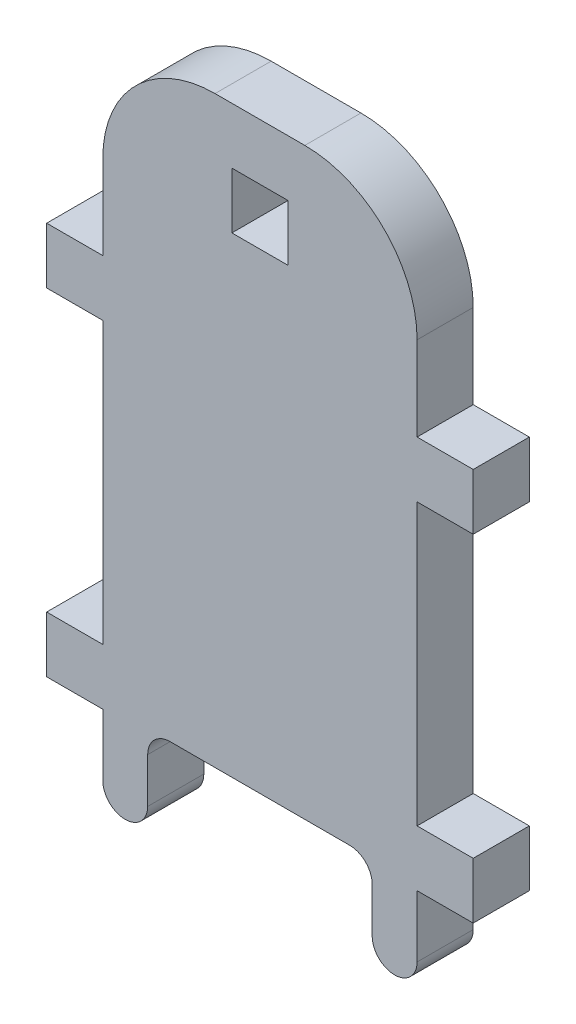
ISO-10303-21;
HEADER;
FILE_DESCRIPTION(('STEP AP214'),'2;1');
FILE_NAME('part.step','',(''),(''),'','','');
FILE_SCHEMA(('AUTOMOTIVE_DESIGN { 1 0 10303 214 1 1 1 1 }'));
ENDSEC;
DATA;
#1=APPLICATION_CONTEXT('core data for automotive mechanical design processes');
#2=APPLICATION_PROTOCOL_DEFINITION('international standard','automotive_design',2000,#1);
#3=PRODUCT_CONTEXT('',#1,'mechanical');
#4=PRODUCT('Part','Part','',(#3));
#5=PRODUCT_RELATED_PRODUCT_CATEGORY('part','',(#4));
#6=PRODUCT_DEFINITION_FORMATION('','',#4);
#7=PRODUCT_DEFINITION_CONTEXT('part definition',#1,'design');
#8=PRODUCT_DEFINITION('design','',#6,#7);
#9=PRODUCT_DEFINITION_SHAPE('','',#8);
#10=(LENGTH_UNIT() NAMED_UNIT(*) SI_UNIT(.MILLI.,.METRE.));
#11=(NAMED_UNIT(*) PLANE_ANGLE_UNIT() SI_UNIT($,.RADIAN.));
#12=(NAMED_UNIT(*) SI_UNIT($,.STERADIAN.) SOLID_ANGLE_UNIT());
#13=UNCERTAINTY_MEASURE_WITH_UNIT(LENGTH_MEASURE(1.E-05),#10,'distance_accuracy_value','');
#14=(GEOMETRIC_REPRESENTATION_CONTEXT(3) GLOBAL_UNCERTAINTY_ASSIGNED_CONTEXT((#13)) GLOBAL_UNIT_ASSIGNED_CONTEXT((#10,
#11,#12)) REPRESENTATION_CONTEXT('',''));
#15=CARTESIAN_POINT('',(0.,0.,0.));
#16=DIRECTION('',(0.,0.,1.));
#17=DIRECTION('',(1.,0.,0.));
#18=AXIS2_PLACEMENT_3D('',#15,#16,#17);
#19=CARTESIAN_POINT('',(0.,0.,5.));
#20=DIRECTION('',(0.,0.,1.));
#21=DIRECTION('',(1.,0.,0.));
#22=AXIS2_PLACEMENT_3D('',#19,#20,#21);
#23=PLANE('',#22);
#24=DIRECTION('',(0.,1.,0.));
#25=VECTOR('',#24,1.);
#26=CARTESIAN_POINT('',(28.,42.5,5.));
#27=LINE('',#26,#25);
#28=CARTESIAN_POINT('',(28.,42.5,5.));
#29=VERTEX_POINT('',#28);
#30=CARTESIAN_POINT('',(28.,50.,5.));
#31=VERTEX_POINT('',#30);
#32=EDGE_CURVE('E359',#29,#31,#27,.T.);
#33=ORIENTED_EDGE('',*,*,#32,.T.);
#34=CARTESIAN_POINT('',(18.,50.,5.));
#35=DIRECTION('',(0.,0.,1.));
#36=DIRECTION('',(1.,0.,0.));
#37=AXIS2_PLACEMENT_3D('',#34,#35,#36);
#38=CIRCLE('',#37,10.);
#39=CARTESIAN_POINT('',(18.,60.,5.));
#40=VERTEX_POINT('',#39);
#41=EDGE_CURVE('E48',#31,#40,#38,.T.);
#42=ORIENTED_EDGE('',*,*,#41,.T.);
#43=DIRECTION('',(-1.,0.,0.));
#44=VECTOR('',#43,1.);
#45=CARTESIAN_POINT('',(0.,60.,5.));
#46=LINE('',#45,#44);
#47=CARTESIAN_POINT('',(10.,60.,5.));
#48=VERTEX_POINT('',#47);
#49=EDGE_CURVE('E362',#40,#48,#46,.T.);
#50=ORIENTED_EDGE('',*,*,#49,.T.);
#51=CARTESIAN_POINT('',(10.,50.,5.));
#52=DIRECTION('',(0.,0.,1.));
#53=DIRECTION('',(1.,0.,0.));
#54=AXIS2_PLACEMENT_3D('',#51,#52,#53);
#55=CIRCLE('',#54,10.);
#56=CARTESIAN_POINT('',(0.,50.,5.));
#57=VERTEX_POINT('',#56);
#58=EDGE_CURVE('E55',#48,#57,#55,.T.);
#59=ORIENTED_EDGE('',*,*,#58,.T.);
#60=DIRECTION('',(0.,-1.,0.));
#61=VECTOR('',#60,1.);
#62=CARTESIAN_POINT('',(0.,42.5,5.));
#63=LINE('',#62,#61);
#64=CARTESIAN_POINT('',(0.,42.5,5.));
#65=VERTEX_POINT('',#64);
#66=EDGE_CURVE('E365',#57,#65,#63,.T.);
#67=ORIENTED_EDGE('',*,*,#66,.T.);
#68=DIRECTION('',(-1.,0.,0.));
#69=VECTOR('',#68,1.);
#70=CARTESIAN_POINT('',(0.,42.5,5.));
#71=LINE('',#70,#69);
#72=CARTESIAN_POINT('',(-5.,42.5,5.));
#73=VERTEX_POINT('',#72);
#74=EDGE_CURVE('E368',#65,#73,#71,.T.);
#75=ORIENTED_EDGE('',*,*,#74,.T.);
#76=DIRECTION('',(0.,-1.,0.));
#77=VECTOR('',#76,1.);
#78=CARTESIAN_POINT('',(-5.,42.5,5.));
#79=LINE('',#78,#77);
#80=CARTESIAN_POINT('',(-5.,37.5,5.));
#81=VERTEX_POINT('',#80);
#82=EDGE_CURVE('E371',#73,#81,#79,.T.);
#83=ORIENTED_EDGE('',*,*,#82,.T.);
#84=DIRECTION('',(1.,0.,0.));
#85=VECTOR('',#84,1.);
#86=CARTESIAN_POINT('',(0.,37.5,5.));
#87=LINE('',#86,#85);
#88=CARTESIAN_POINT('',(0.,37.5,5.));
#89=VERTEX_POINT('',#88);
#90=EDGE_CURVE('E374',#81,#89,#87,.T.);
#91=ORIENTED_EDGE('',*,*,#90,.T.);
#92=DIRECTION('',(0.,-1.,0.));
#93=VECTOR('',#92,1.);
#94=CARTESIAN_POINT('',(0.,12.5,5.));
#95=LINE('',#94,#93);
#96=CARTESIAN_POINT('',(0.,12.5,5.));
#97=VERTEX_POINT('',#96);
#98=EDGE_CURVE('E377',#89,#97,#95,.T.);
#99=ORIENTED_EDGE('',*,*,#98,.T.);
#100=DIRECTION('',(-1.,0.,0.));
#101=VECTOR('',#100,1.);
#102=CARTESIAN_POINT('',(0.,12.5,5.));
#103=LINE('',#102,#101);
#104=CARTESIAN_POINT('',(-5.,12.5,5.));
#105=VERTEX_POINT('',#104);
#106=EDGE_CURVE('E380',#97,#105,#103,.T.);
#107=ORIENTED_EDGE('',*,*,#106,.T.);
#108=DIRECTION('',(0.,-1.,0.));
#109=VECTOR('',#108,1.);
#110=CARTESIAN_POINT('',(-5.,7.5,5.));
#111=LINE('',#110,#109);
#112=CARTESIAN_POINT('',(-5.,7.5,5.));
#113=VERTEX_POINT('',#112);
#114=EDGE_CURVE('E383',#105,#113,#111,.T.);
#115=ORIENTED_EDGE('',*,*,#114,.T.);
#116=DIRECTION('',(1.,0.,0.));
#117=VECTOR('',#116,1.);
#118=CARTESIAN_POINT('',(0.,7.5,5.));
#119=LINE('',#118,#117);
#120=CARTESIAN_POINT('',(0.,7.5,5.));
#121=VERTEX_POINT('',#120);
#122=EDGE_CURVE('E386',#113,#121,#119,.T.);
#123=ORIENTED_EDGE('',*,*,#122,.T.);
#124=DIRECTION('',(0.,-1.,0.));
#125=VECTOR('',#124,1.);
#126=CARTESIAN_POINT('',(0.,0.,5.));
#127=LINE('',#126,#125);
#128=CARTESIAN_POINT('',(0.,2.,5.));
#129=VERTEX_POINT('',#128);
#130=EDGE_CURVE('E319',#121,#129,#127,.T.);
#131=ORIENTED_EDGE('',*,*,#130,.T.);
#132=CARTESIAN_POINT('',(2.,2.,5.));
#133=DIRECTION('',(0.,0.,1.));
#134=DIRECTION('',(1.,0.,0.));
#135=AXIS2_PLACEMENT_3D('',#132,#133,#134);
#136=CIRCLE('',#135,2.);
#137=CARTESIAN_POINT('',(2.,0.,5.));
#138=VERTEX_POINT('',#137);
#139=EDGE_CURVE('E568',#129,#138,#136,.T.);
#140=ORIENTED_EDGE('',*,*,#139,.T.);
#141=CARTESIAN_POINT('',(2.,2.,5.));
#142=DIRECTION('',(0.,0.,1.));
#143=DIRECTION('',(1.,0.,0.));
#144=AXIS2_PLACEMENT_3D('',#141,#142,#143);
#145=CIRCLE('',#144,2.);
#146=CARTESIAN_POINT('',(4.,2.,5.));
#147=VERTEX_POINT('',#146);
#148=EDGE_CURVE('E565',#138,#147,#145,.T.);
#149=ORIENTED_EDGE('',*,*,#148,.T.);
#150=DIRECTION('',(0.,1.,0.));
#151=VECTOR('',#150,1.);
#152=CARTESIAN_POINT('',(4.,0.,5.));
#153=LINE('',#152,#151);
#154=CARTESIAN_POINT('',(4.,6.,5.));
#155=VERTEX_POINT('',#154);
#156=EDGE_CURVE('E323',#147,#155,#153,.T.);
#157=ORIENTED_EDGE('',*,*,#156,.T.);
#158=CARTESIAN_POINT('',(6.,6.,5.));
#159=DIRECTION('',(0.,0.,1.));
#160=DIRECTION('',(1.,0.,0.));
#161=AXIS2_PLACEMENT_3D('',#158,#159,#160);
#162=CIRCLE('',#161,2.);
#163=CARTESIAN_POINT('',(6.,8.,5.));
#164=VERTEX_POINT('',#163);
#165=EDGE_CURVE('E546',#155,#164,#162,.F.);
#166=ORIENTED_EDGE('',*,*,#165,.T.);
#167=DIRECTION('',(1.,0.,0.));
#168=VECTOR('',#167,1.);
#169=CARTESIAN_POINT('',(4.,8.,5.));
#170=LINE('',#169,#168);
#171=CARTESIAN_POINT('',(22.,8.,5.));
#172=VERTEX_POINT('',#171);
#173=EDGE_CURVE('E327',#164,#172,#170,.T.);
#174=ORIENTED_EDGE('',*,*,#173,.T.);
#175=CARTESIAN_POINT('',(22.,6.,5.));
#176=DIRECTION('',(0.,0.,1.));
#177=DIRECTION('',(1.,0.,0.));
#178=AXIS2_PLACEMENT_3D('',#175,#176,#177);
#179=CIRCLE('',#178,2.);
#180=CARTESIAN_POINT('',(24.,6.,5.));
#181=VERTEX_POINT('',#180);
#182=EDGE_CURVE('E539',#172,#181,#179,.F.);
#183=ORIENTED_EDGE('',*,*,#182,.T.);
#184=DIRECTION('',(0.,-1.,0.));
#185=VECTOR('',#184,1.);
#186=CARTESIAN_POINT('',(24.,8.,5.));
#187=LINE('',#186,#185);
#188=CARTESIAN_POINT('',(24.,2.,5.));
#189=VERTEX_POINT('',#188);
#190=EDGE_CURVE('E331',#181,#189,#187,.T.);
#191=ORIENTED_EDGE('',*,*,#190,.T.);
#192=CARTESIAN_POINT('',(26.,2.,5.));
#193=DIRECTION('',(0.,0.,1.));
#194=DIRECTION('',(1.,0.,0.));
#195=AXIS2_PLACEMENT_3D('',#192,#193,#194);
#196=CIRCLE('',#195,2.);
#197=CARTESIAN_POINT('',(26.,0.,5.));
#198=VERTEX_POINT('',#197);
#199=EDGE_CURVE('E574',#189,#198,#196,.T.);
#200=ORIENTED_EDGE('',*,*,#199,.T.);
#201=CARTESIAN_POINT('',(26.,2.,5.));
#202=DIRECTION('',(0.,0.,1.));
#203=DIRECTION('',(1.,0.,0.));
#204=AXIS2_PLACEMENT_3D('',#201,#202,#203);
#205=CIRCLE('',#204,2.);
#206=CARTESIAN_POINT('',(28.,2.,5.));
#207=VERTEX_POINT('',#206);
#208=EDGE_CURVE('E571',#198,#207,#205,.T.);
#209=ORIENTED_EDGE('',*,*,#208,.T.);
#210=DIRECTION('',(0.,1.,0.));
#211=VECTOR('',#210,1.);
#212=CARTESIAN_POINT('',(28.,0.,5.));
#213=LINE('',#212,#211);
#214=CARTESIAN_POINT('',(28.,7.5,5.));
#215=VERTEX_POINT('',#214);
#216=EDGE_CURVE('E335',#207,#215,#213,.T.);
#217=ORIENTED_EDGE('',*,*,#216,.T.);
#218=DIRECTION('',(1.,0.,0.));
#219=VECTOR('',#218,1.);
#220=CARTESIAN_POINT('',(28.,7.5,5.));
#221=LINE('',#220,#219);
#222=CARTESIAN_POINT('',(33.,7.5,5.));
#223=VERTEX_POINT('',#222);
#224=EDGE_CURVE('E338',#215,#223,#221,.T.);
#225=ORIENTED_EDGE('',*,*,#224,.T.);
#226=DIRECTION('',(0.,1.,0.));
#227=VECTOR('',#226,1.);
#228=CARTESIAN_POINT('',(33.,7.5,5.));
#229=LINE('',#228,#227);
#230=CARTESIAN_POINT('',(33.,12.5,5.));
#231=VERTEX_POINT('',#230);
#232=EDGE_CURVE('E341',#223,#231,#229,.T.);
#233=ORIENTED_EDGE('',*,*,#232,.T.);
#234=DIRECTION('',(-1.,0.,0.));
#235=VECTOR('',#234,1.);
#236=CARTESIAN_POINT('',(28.,12.5,5.));
#237=LINE('',#236,#235);
#238=CARTESIAN_POINT('',(28.,12.5,5.));
#239=VERTEX_POINT('',#238);
#240=EDGE_CURVE('E344',#231,#239,#237,.T.);
#241=ORIENTED_EDGE('',*,*,#240,.T.);
#242=DIRECTION('',(0.,1.,0.));
#243=VECTOR('',#242,1.);
#244=CARTESIAN_POINT('',(28.,12.5,5.));
#245=LINE('',#244,#243);
#246=CARTESIAN_POINT('',(28.,37.5,5.));
#247=VERTEX_POINT('',#246);
#248=EDGE_CURVE('E347',#239,#247,#245,.T.);
#249=ORIENTED_EDGE('',*,*,#248,.T.);
#250=DIRECTION('',(1.,0.,0.));
#251=VECTOR('',#250,1.);
#252=CARTESIAN_POINT('',(28.,37.5,5.));
#253=LINE('',#252,#251);
#254=CARTESIAN_POINT('',(33.,37.5,5.));
#255=VERTEX_POINT('',#254);
#256=EDGE_CURVE('E350',#247,#255,#253,.T.);
#257=ORIENTED_EDGE('',*,*,#256,.T.);
#258=DIRECTION('',(0.,1.,0.));
#259=VECTOR('',#258,1.);
#260=CARTESIAN_POINT('',(33.,42.5,5.));
#261=LINE('',#260,#259);
#262=CARTESIAN_POINT('',(33.,42.5,5.));
#263=VERTEX_POINT('',#262);
#264=EDGE_CURVE('E353',#255,#263,#261,.T.);
#265=ORIENTED_EDGE('',*,*,#264,.T.);
#266=DIRECTION('',(-1.,0.,0.));
#267=VECTOR('',#266,1.);
#268=CARTESIAN_POINT('',(28.,42.5,5.));
#269=LINE('',#268,#267);
#270=EDGE_CURVE('E356',#263,#29,#269,.T.);
#271=ORIENTED_EDGE('',*,*,#270,.T.);
#272=EDGE_LOOP('',(#33,#42,#50,#59,#67,#75,#83,#91,#99,#107,#115,#123,#131,#140,#149,#157,#166,
#174,#183,#191,#200,#209,#217,#225,#233,#241,#249,#257,#265,#271));
#273=FACE_BOUND('',#272,.T.);
#274=DIRECTION('',(1.,0.,0.));
#275=VECTOR('',#274,1.);
#276=CARTESIAN_POINT('',(11.5,50.,5.));
#277=LINE('',#276,#275);
#278=CARTESIAN_POINT('',(11.5,50.,5.));
#279=VERTEX_POINT('',#278);
#280=CARTESIAN_POINT('',(16.5,50.,5.));
#281=VERTEX_POINT('',#280);
#282=EDGE_CURVE('E276',#279,#281,#277,.T.);
#283=ORIENTED_EDGE('',*,*,#282,.F.);
#284=DIRECTION('',(0.,-1.,0.));
#285=VECTOR('',#284,1.);
#286=CARTESIAN_POINT('',(11.5,55.,5.));
#287=LINE('',#286,#285);
#288=CARTESIAN_POINT('',(11.5,55.,5.));
#289=VERTEX_POINT('',#288);
#290=EDGE_CURVE('E265',#289,#279,#287,.T.);
#291=ORIENTED_EDGE('',*,*,#290,.F.);
#292=DIRECTION('',(-1.,0.,0.));
#293=VECTOR('',#292,1.);
#294=CARTESIAN_POINT('',(11.5,55.,5.));
#295=LINE('',#294,#293);
#296=CARTESIAN_POINT('',(16.5,55.,5.));
#297=VERTEX_POINT('',#296);
#298=EDGE_CURVE('E294',#297,#289,#295,.T.);
#299=ORIENTED_EDGE('',*,*,#298,.F.);
#300=DIRECTION('',(0.,1.,0.));
#301=VECTOR('',#300,1.);
#302=CARTESIAN_POINT('',(16.5,55.,5.));
#303=LINE('',#302,#301);
#304=EDGE_CURVE('E290',#281,#297,#303,.T.);
#305=ORIENTED_EDGE('',*,*,#304,.F.);
#306=EDGE_LOOP('',(#283,#291,#299,#305));
#307=FACE_BOUND('',#306,.T.);
#308=ADVANCED_FACE('F39',(#273,#307),#23,.T.);
#309=CARTESIAN_POINT('',(0.,0.,0.));
#310=DIRECTION('',(0.,0.,1.));
#311=DIRECTION('',(1.,0.,0.));
#312=AXIS2_PLACEMENT_3D('',#309,#310,#311);
#313=PLANE('',#312);
#314=DIRECTION('',(-1.,0.,0.));
#315=VECTOR('',#314,1.);
#316=CARTESIAN_POINT('',(0.,60.,0.));
#317=LINE('',#316,#315);
#318=CARTESIAN_POINT('',(18.,60.,0.));
#319=VERTEX_POINT('',#318);
#320=CARTESIAN_POINT('',(10.,60.,0.));
#321=VERTEX_POINT('',#320);
#322=EDGE_CURVE('E431',#319,#321,#317,.T.);
#323=ORIENTED_EDGE('',*,*,#322,.F.);
#324=CARTESIAN_POINT('',(18.,50.,0.));
#325=DIRECTION('',(0.,0.,1.));
#326=DIRECTION('',(1.,0.,0.));
#327=AXIS2_PLACEMENT_3D('',#324,#325,#326);
#328=CIRCLE('',#327,10.);
#329=CARTESIAN_POINT('',(28.,50.,0.));
#330=VERTEX_POINT('',#329);
#331=EDGE_CURVE('E604',#319,#330,#328,.F.);
#332=ORIENTED_EDGE('',*,*,#331,.T.);
#333=DIRECTION('',(0.,1.,0.));
#334=VECTOR('',#333,1.);
#335=CARTESIAN_POINT('',(28.,42.5,0.));
#336=LINE('',#335,#334);
#337=CARTESIAN_POINT('',(28.,42.5,0.));
#338=VERTEX_POINT('',#337);
#339=EDGE_CURVE('E428',#338,#330,#336,.T.);
#340=ORIENTED_EDGE('',*,*,#339,.F.);
#341=DIRECTION('',(-1.,0.,0.));
#342=VECTOR('',#341,1.);
#343=CARTESIAN_POINT('',(28.,42.5,0.));
#344=LINE('',#343,#342);
#345=CARTESIAN_POINT('',(33.,42.5,0.));
#346=VERTEX_POINT('',#345);
#347=EDGE_CURVE('E425',#346,#338,#344,.T.);
#348=ORIENTED_EDGE('',*,*,#347,.F.);
#349=DIRECTION('',(0.,1.,0.));
#350=VECTOR('',#349,1.);
#351=CARTESIAN_POINT('',(33.,42.5,0.));
#352=LINE('',#351,#350);
#353=CARTESIAN_POINT('',(33.,37.5,0.));
#354=VERTEX_POINT('',#353);
#355=EDGE_CURVE('E422',#354,#346,#352,.T.);
#356=ORIENTED_EDGE('',*,*,#355,.F.);
#357=DIRECTION('',(1.,0.,0.));
#358=VECTOR('',#357,1.);
#359=CARTESIAN_POINT('',(28.,37.5,0.));
#360=LINE('',#359,#358);
#361=CARTESIAN_POINT('',(28.,37.5,0.));
#362=VERTEX_POINT('',#361);
#363=EDGE_CURVE('E419',#362,#354,#360,.T.);
#364=ORIENTED_EDGE('',*,*,#363,.F.);
#365=DIRECTION('',(0.,1.,0.));
#366=VECTOR('',#365,1.);
#367=CARTESIAN_POINT('',(28.,12.5,0.));
#368=LINE('',#367,#366);
#369=CARTESIAN_POINT('',(28.,12.5,0.));
#370=VERTEX_POINT('',#369);
#371=EDGE_CURVE('E416',#370,#362,#368,.T.);
#372=ORIENTED_EDGE('',*,*,#371,.F.);
#373=DIRECTION('',(-1.,0.,0.));
#374=VECTOR('',#373,1.);
#375=CARTESIAN_POINT('',(28.,12.5,0.));
#376=LINE('',#375,#374);
#377=CARTESIAN_POINT('',(33.,12.5,0.));
#378=VERTEX_POINT('',#377);
#379=EDGE_CURVE('E413',#378,#370,#376,.T.);
#380=ORIENTED_EDGE('',*,*,#379,.F.);
#381=DIRECTION('',(0.,1.,0.));
#382=VECTOR('',#381,1.);
#383=CARTESIAN_POINT('',(33.,7.5,0.));
#384=LINE('',#383,#382);
#385=CARTESIAN_POINT('',(33.,7.5,0.));
#386=VERTEX_POINT('',#385);
#387=EDGE_CURVE('E410',#386,#378,#384,.T.);
#388=ORIENTED_EDGE('',*,*,#387,.F.);
#389=DIRECTION('',(1.,0.,0.));
#390=VECTOR('',#389,1.);
#391=CARTESIAN_POINT('',(28.,7.5,0.));
#392=LINE('',#391,#390);
#393=CARTESIAN_POINT('',(28.,7.5,0.));
#394=VERTEX_POINT('',#393);
#395=EDGE_CURVE('E407',#394,#386,#392,.T.);
#396=ORIENTED_EDGE('',*,*,#395,.F.);
#397=DIRECTION('',(0.,1.,0.));
#398=VECTOR('',#397,1.);
#399=CARTESIAN_POINT('',(28.,0.,0.));
#400=LINE('',#399,#398);
#401=CARTESIAN_POINT('',(28.,2.,0.));
#402=VERTEX_POINT('',#401);
#403=EDGE_CURVE('E404',#402,#394,#400,.T.);
#404=ORIENTED_EDGE('',*,*,#403,.F.);
#405=CARTESIAN_POINT('',(26.,2.,0.));
#406=DIRECTION('',(0.,0.,1.));
#407=DIRECTION('',(1.,0.,0.));
#408=AXIS2_PLACEMENT_3D('',#405,#406,#407);
#409=CIRCLE('',#408,2.);
#410=CARTESIAN_POINT('',(26.,0.,0.));
#411=VERTEX_POINT('',#410);
#412=EDGE_CURVE('E555',#402,#411,#409,.F.);
#413=ORIENTED_EDGE('',*,*,#412,.T.);
#414=CARTESIAN_POINT('',(26.,2.,0.));
#415=DIRECTION('',(0.,0.,1.));
#416=DIRECTION('',(1.,0.,0.));
#417=AXIS2_PLACEMENT_3D('',#414,#415,#416);
#418=CIRCLE('',#417,2.);
#419=CARTESIAN_POINT('',(24.,2.,0.));
#420=VERTEX_POINT('',#419);
#421=EDGE_CURVE('E558',#411,#420,#418,.F.);
#422=ORIENTED_EDGE('',*,*,#421,.T.);
#423=DIRECTION('',(0.,-1.,0.));
#424=VECTOR('',#423,1.);
#425=CARTESIAN_POINT('',(24.,8.,0.));
#426=LINE('',#425,#424);
#427=CARTESIAN_POINT('',(24.,6.,0.));
#428=VERTEX_POINT('',#427);
#429=EDGE_CURVE('E400',#428,#420,#426,.T.);
#430=ORIENTED_EDGE('',*,*,#429,.F.);
#431=CARTESIAN_POINT('',(22.,6.,0.));
#432=DIRECTION('',(0.,0.,1.));
#433=DIRECTION('',(1.,0.,0.));
#434=AXIS2_PLACEMENT_3D('',#431,#432,#433);
#435=CIRCLE('',#434,2.);
#436=CARTESIAN_POINT('',(22.,8.,0.));
#437=VERTEX_POINT('',#436);
#438=EDGE_CURVE('E536',#428,#437,#435,.T.);
#439=ORIENTED_EDGE('',*,*,#438,.T.);
#440=DIRECTION('',(1.,0.,0.));
#441=VECTOR('',#440,1.);
#442=CARTESIAN_POINT('',(4.,8.,0.));
#443=LINE('',#442,#441);
#444=CARTESIAN_POINT('',(6.,8.,0.));
#445=VERTEX_POINT('',#444);
#446=EDGE_CURVE('E396',#445,#437,#443,.T.);
#447=ORIENTED_EDGE('',*,*,#446,.F.);
#448=CARTESIAN_POINT('',(6.,6.,0.));
#449=DIRECTION('',(0.,0.,1.));
#450=DIRECTION('',(1.,0.,0.));
#451=AXIS2_PLACEMENT_3D('',#448,#449,#450);
#452=CIRCLE('',#451,2.);
#453=CARTESIAN_POINT('',(4.,6.,0.));
#454=VERTEX_POINT('',#453);
#455=EDGE_CURVE('E542',#445,#454,#452,.T.);
#456=ORIENTED_EDGE('',*,*,#455,.T.);
#457=DIRECTION('',(0.,1.,0.));
#458=VECTOR('',#457,1.);
#459=CARTESIAN_POINT('',(4.,0.,0.));
#460=LINE('',#459,#458);
#461=CARTESIAN_POINT('',(4.,2.,0.));
#462=VERTEX_POINT('',#461);
#463=EDGE_CURVE('E393',#462,#454,#460,.T.);
#464=ORIENTED_EDGE('',*,*,#463,.F.);
#465=CARTESIAN_POINT('',(2.,2.,0.));
#466=DIRECTION('',(0.,0.,1.));
#467=DIRECTION('',(1.,0.,0.));
#468=AXIS2_PLACEMENT_3D('',#465,#466,#467);
#469=CIRCLE('',#468,2.);
#470=CARTESIAN_POINT('',(2.,0.,0.));
#471=VERTEX_POINT('',#470);
#472=EDGE_CURVE('E549',#462,#471,#469,.F.);
#473=ORIENTED_EDGE('',*,*,#472,.T.);
#474=CARTESIAN_POINT('',(2.,2.,0.));
#475=DIRECTION('',(0.,0.,1.));
#476=DIRECTION('',(1.,0.,0.));
#477=AXIS2_PLACEMENT_3D('',#474,#475,#476);
#478=CIRCLE('',#477,2.);
#479=CARTESIAN_POINT('',(0.,2.,0.));
#480=VERTEX_POINT('',#479);
#481=EDGE_CURVE('E552',#471,#480,#478,.F.);
#482=ORIENTED_EDGE('',*,*,#481,.T.);
#483=DIRECTION('',(0.,-1.,0.));
#484=VECTOR('',#483,1.);
#485=CARTESIAN_POINT('',(0.,0.,0.));
#486=LINE('',#485,#484);
#487=CARTESIAN_POINT('',(0.,7.5,0.));
#488=VERTEX_POINT('',#487);
#489=EDGE_CURVE('E285',#488,#480,#486,.T.);
#490=ORIENTED_EDGE('',*,*,#489,.F.);
#491=DIRECTION('',(1.,0.,0.));
#492=VECTOR('',#491,1.);
#493=CARTESIAN_POINT('',(0.,7.5,0.));
#494=LINE('',#493,#492);
#495=CARTESIAN_POINT('',(-5.,7.5,0.));
#496=VERTEX_POINT('',#495);
#497=EDGE_CURVE('E324',#496,#488,#494,.T.);
#498=ORIENTED_EDGE('',*,*,#497,.F.);
#499=DIRECTION('',(0.,-1.,0.));
#500=VECTOR('',#499,1.);
#501=CARTESIAN_POINT('',(-5.,7.5,0.));
#502=LINE('',#501,#500);
#503=CARTESIAN_POINT('',(-5.,12.5,0.));
#504=VERTEX_POINT('',#503);
#505=EDGE_CURVE('E453',#504,#496,#502,.T.);
#506=ORIENTED_EDGE('',*,*,#505,.F.);
#507=DIRECTION('',(-1.,0.,0.));
#508=VECTOR('',#507,1.);
#509=CARTESIAN_POINT('',(0.,12.5,0.));
#510=LINE('',#509,#508);
#511=CARTESIAN_POINT('',(0.,12.5,0.));
#512=VERTEX_POINT('',#511);
#513=EDGE_CURVE('E450',#512,#504,#510,.T.);
#514=ORIENTED_EDGE('',*,*,#513,.F.);
#515=DIRECTION('',(0.,-1.,0.));
#516=VECTOR('',#515,1.);
#517=CARTESIAN_POINT('',(0.,12.5,0.));
#518=LINE('',#517,#516);
#519=CARTESIAN_POINT('',(0.,37.5,0.));
#520=VERTEX_POINT('',#519);
#521=EDGE_CURVE('E447',#520,#512,#518,.T.);
#522=ORIENTED_EDGE('',*,*,#521,.F.);
#523=DIRECTION('',(1.,0.,0.));
#524=VECTOR('',#523,1.);
#525=CARTESIAN_POINT('',(0.,37.5,0.));
#526=LINE('',#525,#524);
#527=CARTESIAN_POINT('',(-5.,37.5,0.));
#528=VERTEX_POINT('',#527);
#529=EDGE_CURVE('E444',#528,#520,#526,.T.);
#530=ORIENTED_EDGE('',*,*,#529,.F.);
#531=DIRECTION('',(0.,-1.,0.));
#532=VECTOR('',#531,1.);
#533=CARTESIAN_POINT('',(-5.,42.5,0.));
#534=LINE('',#533,#532);
#535=CARTESIAN_POINT('',(-5.,42.5,0.));
#536=VERTEX_POINT('',#535);
#537=EDGE_CURVE('E441',#536,#528,#534,.T.);
#538=ORIENTED_EDGE('',*,*,#537,.F.);
#539=DIRECTION('',(-1.,0.,0.));
#540=VECTOR('',#539,1.);
#541=CARTESIAN_POINT('',(0.,42.5,0.));
#542=LINE('',#541,#540);
#543=CARTESIAN_POINT('',(0.,42.5,0.));
#544=VERTEX_POINT('',#543);
#545=EDGE_CURVE('E438',#544,#536,#542,.T.);
#546=ORIENTED_EDGE('',*,*,#545,.F.);
#547=DIRECTION('',(0.,-1.,0.));
#548=VECTOR('',#547,1.);
#549=CARTESIAN_POINT('',(0.,42.5,0.));
#550=LINE('',#549,#548);
#551=CARTESIAN_POINT('',(0.,50.,0.));
#552=VERTEX_POINT('',#551);
#553=EDGE_CURVE('E435',#552,#544,#550,.T.);
#554=ORIENTED_EDGE('',*,*,#553,.F.);
#555=CARTESIAN_POINT('',(10.,50.,0.));
#556=DIRECTION('',(0.,0.,1.));
#557=DIRECTION('',(1.,0.,0.));
#558=AXIS2_PLACEMENT_3D('',#555,#556,#557);
#559=CIRCLE('',#558,10.);
#560=EDGE_CURVE('E601',#552,#321,#559,.F.);
#561=ORIENTED_EDGE('',*,*,#560,.T.);
#562=EDGE_LOOP('',(#323,#332,#340,#348,#356,#364,#372,#380,#388,#396,#404,#413,#422,#430,#439,
#447,#456,#464,#473,#482,#490,#498,#506,#514,#522,#530,#538,#546,#554,#561));
#563=FACE_BOUND('',#562,.T.);
#564=DIRECTION('',(0.,-1.,0.));
#565=VECTOR('',#564,1.);
#566=CARTESIAN_POINT('',(11.5,55.,0.));
#567=LINE('',#566,#565);
#568=CARTESIAN_POINT('',(11.5,55.,0.));
#569=VERTEX_POINT('',#568);
#570=CARTESIAN_POINT('',(11.5,50.,0.));
#571=VERTEX_POINT('',#570);
#572=EDGE_CURVE('E299',#569,#571,#567,.T.);
#573=ORIENTED_EDGE('',*,*,#572,.T.);
#574=DIRECTION('',(1.,0.,0.));
#575=VECTOR('',#574,1.);
#576=CARTESIAN_POINT('',(11.5,50.,0.));
#577=LINE('',#576,#575);
#578=CARTESIAN_POINT('',(16.5,50.,0.));
#579=VERTEX_POINT('',#578);
#580=EDGE_CURVE('E283',#571,#579,#577,.T.);
#581=ORIENTED_EDGE('',*,*,#580,.T.);
#582=DIRECTION('',(0.,1.,0.));
#583=VECTOR('',#582,1.);
#584=CARTESIAN_POINT('',(16.5,55.,0.));
#585=LINE('',#584,#583);
#586=CARTESIAN_POINT('',(16.5,55.,0.));
#587=VERTEX_POINT('',#586);
#588=EDGE_CURVE('E305',#579,#587,#585,.T.);
#589=ORIENTED_EDGE('',*,*,#588,.T.);
#590=DIRECTION('',(-1.,0.,0.));
#591=VECTOR('',#590,1.);
#592=CARTESIAN_POINT('',(11.5,55.,0.));
#593=LINE('',#592,#591);
#594=EDGE_CURVE('E277',#587,#569,#593,.T.);
#595=ORIENTED_EDGE('',*,*,#594,.T.);
#596=EDGE_LOOP('',(#573,#581,#589,#595));
#597=FACE_BOUND('',#596,.T.);
#598=ADVANCED_FACE('F622',(#563,#597),#313,.F.);
#599=CARTESIAN_POINT('',(0.,0.,5.));
#600=DIRECTION('',(1.,0.,0.));
#601=DIRECTION('',(0.,1.,0.));
#602=AXIS2_PLACEMENT_3D('',#599,#600,#601);
#603=PLANE('',#602);
#604=ORIENTED_EDGE('',*,*,#489,.T.);
#605=DIRECTION('',(0.,0.,-1.));
#606=VECTOR('',#605,1.);
#607=CARTESIAN_POINT('',(0.,2.,5.));
#608=LINE('',#607,#606);
#609=EDGE_CURVE('E580',#480,#129,#608,.F.);
#610=ORIENTED_EDGE('',*,*,#609,.T.);
#611=ORIENTED_EDGE('',*,*,#130,.F.);
#612=DIRECTION('',(0.,0.,-1.));
#613=VECTOR('',#612,1.);
#614=CARTESIAN_POINT('',(0.,7.5,5.));
#615=LINE('',#614,#613);
#616=EDGE_CURVE('E389',#121,#488,#615,.T.);
#617=ORIENTED_EDGE('',*,*,#616,.T.);
#618=EDGE_LOOP('',(#604,#610,#611,#617));
#619=FACE_BOUND('',#618,.T.);
#620=ADVANCED_FACE('F706',(#619),#603,.F.);
#621=CARTESIAN_POINT('',(4.,0.,5.));
#622=DIRECTION('',(-1.,0.,0.));
#623=DIRECTION('',(0.,-1.,0.));
#624=AXIS2_PLACEMENT_3D('',#621,#622,#623);
#625=PLANE('',#624);
#626=ORIENTED_EDGE('',*,*,#156,.F.);
#627=DIRECTION('',(0.,0.,-1.));
#628=VECTOR('',#627,1.);
#629=CARTESIAN_POINT('',(4.,2.,5.));
#630=LINE('',#629,#628);
#631=EDGE_CURVE('E584',#147,#462,#630,.T.);
#632=ORIENTED_EDGE('',*,*,#631,.T.);
#633=ORIENTED_EDGE('',*,*,#463,.T.);
#634=DIRECTION('',(0.,0.,-1.));
#635=VECTOR('',#634,1.);
#636=CARTESIAN_POINT('',(4.,6.,5.));
#637=LINE('',#636,#635);
#638=EDGE_CURVE('E532',#454,#155,#637,.F.);
#639=ORIENTED_EDGE('',*,*,#638,.T.);
#640=EDGE_LOOP('',(#626,#632,#633,#639));
#641=FACE_BOUND('',#640,.T.);
#642=ADVANCED_FACE('F802',(#641),#625,.F.);
#643=CARTESIAN_POINT('',(4.,8.,5.));
#644=DIRECTION('',(0.,1.,0.));
#645=DIRECTION('',(-1.,0.,0.));
#646=AXIS2_PLACEMENT_3D('',#643,#644,#645);
#647=PLANE('',#646);
#648=ORIENTED_EDGE('',*,*,#446,.T.);
#649=DIRECTION('',(0.,0.,-1.));
#650=VECTOR('',#649,1.);
#651=CARTESIAN_POINT('',(22.,8.,5.));
#652=LINE('',#651,#650);
#653=EDGE_CURVE('E529',#437,#172,#652,.F.);
#654=ORIENTED_EDGE('',*,*,#653,.T.);
#655=ORIENTED_EDGE('',*,*,#173,.F.);
#656=DIRECTION('',(0.,0.,-1.));
#657=VECTOR('',#656,1.);
#658=CARTESIAN_POINT('',(6.,8.,0.));
#659=LINE('',#658,#657);
#660=EDGE_CURVE('E525',#164,#445,#659,.T.);
#661=ORIENTED_EDGE('',*,*,#660,.T.);
#662=EDGE_LOOP('',(#648,#654,#655,#661));
#663=FACE_BOUND('',#662,.T.);
#664=ADVANCED_FACE('F684',(#663),#647,.F.);
#665=CARTESIAN_POINT('',(24.,8.,5.));
#666=DIRECTION('',(1.,0.,0.));
#667=DIRECTION('',(0.,0.,-1.));
#668=AXIS2_PLACEMENT_3D('',#665,#666,#667);
#669=PLANE('',#668);
#670=ORIENTED_EDGE('',*,*,#429,.T.);
#671=DIRECTION('',(0.,0.,-1.));
#672=VECTOR('',#671,1.);
#673=CARTESIAN_POINT('',(24.,2.,5.));
#674=LINE('',#673,#672);
#675=EDGE_CURVE('E561',#420,#189,#674,.F.);
#676=ORIENTED_EDGE('',*,*,#675,.T.);
#677=ORIENTED_EDGE('',*,*,#190,.F.);
#678=DIRECTION('',(0.,0.,-1.));
#679=VECTOR('',#678,1.);
#680=CARTESIAN_POINT('',(24.,6.,0.));
#681=LINE('',#680,#679);
#682=EDGE_CURVE('E521',#181,#428,#681,.T.);
#683=ORIENTED_EDGE('',*,*,#682,.T.);
#684=EDGE_LOOP('',(#670,#676,#677,#683));
#685=FACE_BOUND('',#684,.T.);
#686=ADVANCED_FACE('F675',(#685),#669,.F.);
#687=CARTESIAN_POINT('',(28.,0.,5.));
#688=DIRECTION('',(-1.,0.,0.));
#689=DIRECTION('',(0.,-1.,0.));
#690=AXIS2_PLACEMENT_3D('',#687,#688,#689);
#691=PLANE('',#690);
#692=ORIENTED_EDGE('',*,*,#216,.F.);
#693=DIRECTION('',(0.,0.,-1.));
#694=VECTOR('',#693,1.);
#695=CARTESIAN_POINT('',(28.,2.,5.));
#696=LINE('',#695,#694);
#697=EDGE_CURVE('E577',#207,#402,#696,.T.);
#698=ORIENTED_EDGE('',*,*,#697,.T.);
#699=ORIENTED_EDGE('',*,*,#403,.T.);
#700=DIRECTION('',(0.,0.,-1.));
#701=VECTOR('',#700,1.);
#702=CARTESIAN_POINT('',(28.,7.5,5.));
#703=LINE('',#702,#701);
#704=EDGE_CURVE('E517',#215,#394,#703,.T.);
#705=ORIENTED_EDGE('',*,*,#704,.F.);
#706=EDGE_LOOP('',(#692,#698,#699,#705));
#707=FACE_BOUND('',#706,.T.);
#708=ADVANCED_FACE('F795',(#707),#691,.F.);
#709=CARTESIAN_POINT('',(28.,7.5,5.));
#710=DIRECTION('',(0.,1.,0.));
#711=DIRECTION('',(0.,0.,1.));
#712=AXIS2_PLACEMENT_3D('',#709,#710,#711);
#713=PLANE('',#712);
#714=ORIENTED_EDGE('',*,*,#395,.T.);
#715=DIRECTION('',(0.,0.,-1.));
#716=VECTOR('',#715,1.);
#717=CARTESIAN_POINT('',(33.,7.5,5.));
#718=LINE('',#717,#716);
#719=EDGE_CURVE('E513',#223,#386,#718,.T.);
#720=ORIENTED_EDGE('',*,*,#719,.F.);
#721=ORIENTED_EDGE('',*,*,#224,.F.);
#722=ORIENTED_EDGE('',*,*,#704,.T.);
#723=EDGE_LOOP('',(#714,#720,#721,#722));
#724=FACE_BOUND('',#723,.T.);
#725=ADVANCED_FACE('F659',(#724),#713,.F.);
#726=CARTESIAN_POINT('',(33.,7.5,5.));
#727=DIRECTION('',(-1.,0.,0.));
#728=DIRECTION('',(0.,0.,1.));
#729=AXIS2_PLACEMENT_3D('',#726,#727,#728);
#730=PLANE('',#729);
#731=ORIENTED_EDGE('',*,*,#387,.T.);
#732=DIRECTION('',(0.,0.,-1.));
#733=VECTOR('',#732,1.);
#734=CARTESIAN_POINT('',(33.,12.5,5.));
#735=LINE('',#734,#733);
#736=EDGE_CURVE('E509',#231,#378,#735,.T.);
#737=ORIENTED_EDGE('',*,*,#736,.F.);
#738=ORIENTED_EDGE('',*,*,#232,.F.);
#739=ORIENTED_EDGE('',*,*,#719,.T.);
#740=EDGE_LOOP('',(#731,#737,#738,#739));
#741=FACE_BOUND('',#740,.T.);
#742=ADVANCED_FACE('F655',(#741),#730,.F.);
#743=CARTESIAN_POINT('',(28.,12.5,5.));
#744=DIRECTION('',(0.,-1.,0.));
#745=DIRECTION('',(1.,0.,0.));
#746=AXIS2_PLACEMENT_3D('',#743,#744,#745);
#747=PLANE('',#746);
#748=ORIENTED_EDGE('',*,*,#379,.T.);
#749=DIRECTION('',(0.,0.,-1.));
#750=VECTOR('',#749,1.);
#751=CARTESIAN_POINT('',(28.,12.5,5.));
#752=LINE('',#751,#750);
#753=EDGE_CURVE('E505',#239,#370,#752,.T.);
#754=ORIENTED_EDGE('',*,*,#753,.F.);
#755=ORIENTED_EDGE('',*,*,#240,.F.);
#756=ORIENTED_EDGE('',*,*,#736,.T.);
#757=EDGE_LOOP('',(#748,#754,#755,#756));
#758=FACE_BOUND('',#757,.T.);
#759=ADVANCED_FACE('F650',(#758),#747,.F.);
#760=CARTESIAN_POINT('',(28.,12.5,5.));
#761=DIRECTION('',(-1.,0.,0.));
#762=DIRECTION('',(0.,-1.,0.));
#763=AXIS2_PLACEMENT_3D('',#760,#761,#762);
#764=PLANE('',#763);
#765=ORIENTED_EDGE('',*,*,#371,.T.);
#766=DIRECTION('',(0.,0.,-1.));
#767=VECTOR('',#766,1.);
#768=CARTESIAN_POINT('',(28.,37.5,5.));
#769=LINE('',#768,#767);
#770=EDGE_CURVE('E501',#247,#362,#769,.T.);
#771=ORIENTED_EDGE('',*,*,#770,.F.);
#772=ORIENTED_EDGE('',*,*,#248,.F.);
#773=ORIENTED_EDGE('',*,*,#753,.T.);
#774=EDGE_LOOP('',(#765,#771,#772,#773));
#775=FACE_BOUND('',#774,.T.);
#776=ADVANCED_FACE('F644',(#775),#764,.F.);
#777=CARTESIAN_POINT('',(28.,37.5,5.));
#778=DIRECTION('',(0.,1.,0.));
#779=DIRECTION('',(0.,0.,1.));
#780=AXIS2_PLACEMENT_3D('',#777,#778,#779);
#781=PLANE('',#780);
#782=ORIENTED_EDGE('',*,*,#363,.T.);
#783=DIRECTION('',(0.,0.,-1.));
#784=VECTOR('',#783,1.);
#785=CARTESIAN_POINT('',(33.,37.5,5.));
#786=LINE('',#785,#784);
#787=EDGE_CURVE('E497',#255,#354,#786,.T.);
#788=ORIENTED_EDGE('',*,*,#787,.F.);
#789=ORIENTED_EDGE('',*,*,#256,.F.);
#790=ORIENTED_EDGE('',*,*,#770,.T.);
#791=EDGE_LOOP('',(#782,#788,#789,#790));
#792=FACE_BOUND('',#791,.T.);
#793=ADVANCED_FACE('F640',(#792),#781,.F.);
#794=CARTESIAN_POINT('',(33.,42.5,5.));
#795=DIRECTION('',(-1.,0.,0.));
#796=DIRECTION('',(0.,0.,1.));
#797=AXIS2_PLACEMENT_3D('',#794,#795,#796);
#798=PLANE('',#797);
#799=ORIENTED_EDGE('',*,*,#355,.T.);
#800=DIRECTION('',(0.,0.,-1.));
#801=VECTOR('',#800,1.);
#802=CARTESIAN_POINT('',(33.,42.5,5.));
#803=LINE('',#802,#801);
#804=EDGE_CURVE('E493',#263,#346,#803,.T.);
#805=ORIENTED_EDGE('',*,*,#804,.F.);
#806=ORIENTED_EDGE('',*,*,#264,.F.);
#807=ORIENTED_EDGE('',*,*,#787,.T.);
#808=EDGE_LOOP('',(#799,#805,#806,#807));
#809=FACE_BOUND('',#808,.T.);
#810=ADVANCED_FACE('F635',(#809),#798,.F.);
#811=CARTESIAN_POINT('',(28.,42.5,5.));
#812=DIRECTION('',(0.,-1.,0.));
#813=DIRECTION('',(0.,0.,-1.));
#814=AXIS2_PLACEMENT_3D('',#811,#812,#813);
#815=PLANE('',#814);
#816=ORIENTED_EDGE('',*,*,#347,.T.);
#817=DIRECTION('',(0.,0.,-1.));
#818=VECTOR('',#817,1.);
#819=CARTESIAN_POINT('',(28.,42.5,5.));
#820=LINE('',#819,#818);
#821=EDGE_CURVE('E489',#29,#338,#820,.T.);
#822=ORIENTED_EDGE('',*,*,#821,.F.);
#823=ORIENTED_EDGE('',*,*,#270,.F.);
#824=ORIENTED_EDGE('',*,*,#804,.T.);
#825=EDGE_LOOP('',(#816,#822,#823,#824));
#826=FACE_BOUND('',#825,.T.);
#827=ADVANCED_FACE('F629',(#826),#815,.F.);
#828=CARTESIAN_POINT('',(28.,42.5,5.));
#829=DIRECTION('',(-1.,0.,0.));
#830=DIRECTION('',(0.,-1.,0.));
#831=AXIS2_PLACEMENT_3D('',#828,#829,#830);
#832=PLANE('',#831);
#833=ORIENTED_EDGE('',*,*,#339,.T.);
#834=DIRECTION('',(0.,0.,-1.));
#835=VECTOR('',#834,1.);
#836=CARTESIAN_POINT('',(28.,50.,5.));
#837=LINE('',#836,#835);
#838=EDGE_CURVE('E63',#330,#31,#837,.F.);
#839=ORIENTED_EDGE('',*,*,#838,.T.);
#840=ORIENTED_EDGE('',*,*,#32,.F.);
#841=ORIENTED_EDGE('',*,*,#821,.T.);
#842=EDGE_LOOP('',(#833,#839,#840,#841));
#843=FACE_BOUND('',#842,.T.);
#844=ADVANCED_FACE('F625',(#843),#832,.F.);
#845=CARTESIAN_POINT('',(0.,60.,5.));
#846=DIRECTION('',(0.,-1.,0.));
#847=DIRECTION('',(0.,0.,-1.));
#848=AXIS2_PLACEMENT_3D('',#845,#846,#847);
#849=PLANE('',#848);
#850=ORIENTED_EDGE('',*,*,#49,.F.);
#851=DIRECTION('',(0.,0.,-1.));
#852=VECTOR('',#851,1.);
#853=CARTESIAN_POINT('',(18.,60.,5.));
#854=LINE('',#853,#852);
#855=EDGE_CURVE('E597',#40,#319,#854,.T.);
#856=ORIENTED_EDGE('',*,*,#855,.T.);
#857=ORIENTED_EDGE('',*,*,#322,.T.);
#858=DIRECTION('',(0.,0.,-1.));
#859=VECTOR('',#858,1.);
#860=CARTESIAN_POINT('',(10.,60.,5.));
#861=LINE('',#860,#859);
#862=EDGE_CURVE('E587',#321,#48,#861,.F.);
#863=ORIENTED_EDGE('',*,*,#862,.T.);
#864=EDGE_LOOP('',(#850,#856,#857,#863));
#865=FACE_BOUND('',#864,.T.);
#866=ADVANCED_FACE('F616',(#865),#849,.F.);
#867=CARTESIAN_POINT('',(0.,42.5,5.));
#868=DIRECTION('',(1.,0.,0.));
#869=DIRECTION('',(0.,1.,0.));
#870=AXIS2_PLACEMENT_3D('',#867,#868,#869);
#871=PLANE('',#870);
#872=ORIENTED_EDGE('',*,*,#66,.F.);
#873=DIRECTION('',(0.,0.,-1.));
#874=VECTOR('',#873,1.);
#875=CARTESIAN_POINT('',(0.,50.,5.));
#876=LINE('',#875,#874);
#877=EDGE_CURVE('E11',#57,#552,#876,.T.);
#878=ORIENTED_EDGE('',*,*,#877,.T.);
#879=ORIENTED_EDGE('',*,*,#553,.T.);
#880=DIRECTION('',(0.,0.,-1.));
#881=VECTOR('',#880,1.);
#882=CARTESIAN_POINT('',(0.,42.5,5.));
#883=LINE('',#882,#881);
#884=EDGE_CURVE('E485',#65,#544,#883,.T.);
#885=ORIENTED_EDGE('',*,*,#884,.F.);
#886=EDGE_LOOP('',(#872,#878,#879,#885));
#887=FACE_BOUND('',#886,.T.);
#888=ADVANCED_FACE('F745',(#887),#871,.F.);
#889=CARTESIAN_POINT('',(0.,42.5,5.));
#890=DIRECTION('',(0.,-1.,0.));
#891=DIRECTION('',(0.,0.,-1.));
#892=AXIS2_PLACEMENT_3D('',#889,#890,#891);
#893=PLANE('',#892);
#894=ORIENTED_EDGE('',*,*,#545,.T.);
#895=DIRECTION('',(0.,0.,-1.));
#896=VECTOR('',#895,1.);
#897=CARTESIAN_POINT('',(-5.,42.5,5.));
#898=LINE('',#897,#896);
#899=EDGE_CURVE('E481',#73,#536,#898,.T.);
#900=ORIENTED_EDGE('',*,*,#899,.F.);
#901=ORIENTED_EDGE('',*,*,#74,.F.);
#902=ORIENTED_EDGE('',*,*,#884,.T.);
#903=EDGE_LOOP('',(#894,#900,#901,#902));
#904=FACE_BOUND('',#903,.T.);
#905=ADVANCED_FACE('F741',(#904),#893,.F.);
#906=CARTESIAN_POINT('',(-5.,42.5,5.));
#907=DIRECTION('',(1.,0.,0.));
#908=DIRECTION('',(0.,1.,0.));
#909=AXIS2_PLACEMENT_3D('',#906,#907,#908);
#910=PLANE('',#909);
#911=ORIENTED_EDGE('',*,*,#537,.T.);
#912=DIRECTION('',(0.,0.,-1.));
#913=VECTOR('',#912,1.);
#914=CARTESIAN_POINT('',(-5.,37.5,5.));
#915=LINE('',#914,#913);
#916=EDGE_CURVE('E477',#81,#528,#915,.T.);
#917=ORIENTED_EDGE('',*,*,#916,.F.);
#918=ORIENTED_EDGE('',*,*,#82,.F.);
#919=ORIENTED_EDGE('',*,*,#899,.T.);
#920=EDGE_LOOP('',(#911,#917,#918,#919));
#921=FACE_BOUND('',#920,.T.);
#922=ADVANCED_FACE('F737',(#921),#910,.F.);
#923=CARTESIAN_POINT('',(0.,37.5,5.));
#924=DIRECTION('',(0.,1.,0.));
#925=DIRECTION('',(0.,0.,1.));
#926=AXIS2_PLACEMENT_3D('',#923,#924,#925);
#927=PLANE('',#926);
#928=ORIENTED_EDGE('',*,*,#529,.T.);
#929=DIRECTION('',(0.,0.,-1.));
#930=VECTOR('',#929,1.);
#931=CARTESIAN_POINT('',(0.,37.5,5.));
#932=LINE('',#931,#930);
#933=EDGE_CURVE('E473',#89,#520,#932,.T.);
#934=ORIENTED_EDGE('',*,*,#933,.F.);
#935=ORIENTED_EDGE('',*,*,#90,.F.);
#936=ORIENTED_EDGE('',*,*,#916,.T.);
#937=EDGE_LOOP('',(#928,#934,#935,#936));
#938=FACE_BOUND('',#937,.T.);
#939=ADVANCED_FACE('F732',(#938),#927,.F.);
#940=CARTESIAN_POINT('',(0.,12.5,5.));
#941=DIRECTION('',(1.,0.,0.));
#942=DIRECTION('',(0.,1.,0.));
#943=AXIS2_PLACEMENT_3D('',#940,#941,#942);
#944=PLANE('',#943);
#945=ORIENTED_EDGE('',*,*,#521,.T.);
#946=DIRECTION('',(0.,0.,-1.));
#947=VECTOR('',#946,1.);
#948=CARTESIAN_POINT('',(0.,12.5,5.));
#949=LINE('',#948,#947);
#950=EDGE_CURVE('E469',#97,#512,#949,.T.);
#951=ORIENTED_EDGE('',*,*,#950,.F.);
#952=ORIENTED_EDGE('',*,*,#98,.F.);
#953=ORIENTED_EDGE('',*,*,#933,.T.);
#954=EDGE_LOOP('',(#945,#951,#952,#953));
#955=FACE_BOUND('',#954,.T.);
#956=ADVANCED_FACE('F726',(#955),#944,.F.);
#957=CARTESIAN_POINT('',(0.,12.5,5.));
#958=DIRECTION('',(0.,-1.,0.));
#959=DIRECTION('',(1.,0.,0.));
#960=AXIS2_PLACEMENT_3D('',#957,#958,#959);
#961=PLANE('',#960);
#962=ORIENTED_EDGE('',*,*,#513,.T.);
#963=DIRECTION('',(0.,0.,-1.));
#964=VECTOR('',#963,1.);
#965=CARTESIAN_POINT('',(-5.,12.5,5.));
#966=LINE('',#965,#964);
#967=EDGE_CURVE('E465',#105,#504,#966,.T.);
#968=ORIENTED_EDGE('',*,*,#967,.F.);
#969=ORIENTED_EDGE('',*,*,#106,.F.);
#970=ORIENTED_EDGE('',*,*,#950,.T.);
#971=EDGE_LOOP('',(#962,#968,#969,#970));
#972=FACE_BOUND('',#971,.T.);
#973=ADVANCED_FACE('F722',(#972),#961,.F.);
#974=CARTESIAN_POINT('',(-5.,7.5,5.));
#975=DIRECTION('',(1.,0.,0.));
#976=DIRECTION('',(0.,0.,-1.));
#977=AXIS2_PLACEMENT_3D('',#974,#975,#976);
#978=PLANE('',#977);
#979=ORIENTED_EDGE('',*,*,#505,.T.);
#980=DIRECTION('',(0.,0.,-1.));
#981=VECTOR('',#980,1.);
#982=CARTESIAN_POINT('',(-5.,7.5,5.));
#983=LINE('',#982,#981);
#984=EDGE_CURVE('E461',#113,#496,#983,.T.);
#985=ORIENTED_EDGE('',*,*,#984,.F.);
#986=ORIENTED_EDGE('',*,*,#114,.F.);
#987=ORIENTED_EDGE('',*,*,#967,.T.);
#988=EDGE_LOOP('',(#979,#985,#986,#987));
#989=FACE_BOUND('',#988,.T.);
#990=ADVANCED_FACE('F717',(#989),#978,.F.);
#991=CARTESIAN_POINT('',(0.,7.5,5.));
#992=DIRECTION('',(0.,1.,0.));
#993=DIRECTION('',(-1.,0.,0.));
#994=AXIS2_PLACEMENT_3D('',#991,#992,#993);
#995=PLANE('',#994);
#996=ORIENTED_EDGE('',*,*,#497,.T.);
#997=ORIENTED_EDGE('',*,*,#616,.F.);
#998=ORIENTED_EDGE('',*,*,#122,.F.);
#999=ORIENTED_EDGE('',*,*,#984,.T.);
#1000=EDGE_LOOP('',(#996,#997,#998,#999));
#1001=FACE_BOUND('',#1000,.T.);
#1002=ADVANCED_FACE('F711',(#1001),#995,.F.);
#1003=CARTESIAN_POINT('',(11.5,55.,5.));
#1004=DIRECTION('',(1.,0.,0.));
#1005=DIRECTION('',(0.,0.,-1.));
#1006=AXIS2_PLACEMENT_3D('',#1003,#1004,#1005);
#1007=PLANE('',#1006);
#1008=ORIENTED_EDGE('',*,*,#572,.F.);
#1009=DIRECTION('',(0.,0.,-1.));
#1010=VECTOR('',#1009,1.);
#1011=CARTESIAN_POINT('',(11.5,55.,5.));
#1012=LINE('',#1011,#1010);
#1013=EDGE_CURVE('E271',#289,#569,#1012,.T.);
#1014=ORIENTED_EDGE('',*,*,#1013,.F.);
#1015=ORIENTED_EDGE('',*,*,#290,.T.);
#1016=DIRECTION('',(0.,0.,-1.));
#1017=VECTOR('',#1016,1.);
#1018=CARTESIAN_POINT('',(11.5,50.,5.));
#1019=LINE('',#1018,#1017);
#1020=EDGE_CURVE('E268',#279,#571,#1019,.T.);
#1021=ORIENTED_EDGE('',*,*,#1020,.T.);
#1022=EDGE_LOOP('',(#1008,#1014,#1015,#1021));
#1023=FACE_BOUND('',#1022,.T.);
#1024=ADVANCED_FACE('F267',(#1023),#1007,.T.);
#1025=CARTESIAN_POINT('',(11.5,50.,5.));
#1026=DIRECTION('',(0.,1.,0.));
#1027=DIRECTION('',(0.,0.,1.));
#1028=AXIS2_PLACEMENT_3D('',#1025,#1026,#1027);
#1029=PLANE('',#1028);
#1030=ORIENTED_EDGE('',*,*,#580,.F.);
#1031=ORIENTED_EDGE('',*,*,#1020,.F.);
#1032=ORIENTED_EDGE('',*,*,#282,.T.);
#1033=DIRECTION('',(0.,0.,-1.));
#1034=VECTOR('',#1033,1.);
#1035=CARTESIAN_POINT('',(16.5,50.,5.));
#1036=LINE('',#1035,#1034);
#1037=EDGE_CURVE('E286',#281,#579,#1036,.T.);
#1038=ORIENTED_EDGE('',*,*,#1037,.T.);
#1039=EDGE_LOOP('',(#1030,#1031,#1032,#1038));
#1040=FACE_BOUND('',#1039,.T.);
#1041=ADVANCED_FACE('F280',(#1040),#1029,.T.);
#1042=CARTESIAN_POINT('',(16.5,55.,5.));
#1043=DIRECTION('',(-1.,0.,0.));
#1044=DIRECTION('',(0.,0.,1.));
#1045=AXIS2_PLACEMENT_3D('',#1042,#1043,#1044);
#1046=PLANE('',#1045);
#1047=ORIENTED_EDGE('',*,*,#588,.F.);
#1048=ORIENTED_EDGE('',*,*,#1037,.F.);
#1049=ORIENTED_EDGE('',*,*,#304,.T.);
#1050=DIRECTION('',(0.,0.,-1.));
#1051=VECTOR('',#1050,1.);
#1052=CARTESIAN_POINT('',(16.5,55.,5.));
#1053=LINE('',#1052,#1051);
#1054=EDGE_CURVE('E314',#297,#587,#1053,.T.);
#1055=ORIENTED_EDGE('',*,*,#1054,.T.);
#1056=EDGE_LOOP('',(#1047,#1048,#1049,#1055));
#1057=FACE_BOUND('',#1056,.T.);
#1058=ADVANCED_FACE('F975',(#1057),#1046,.T.);
#1059=CARTESIAN_POINT('',(11.5,55.,5.));
#1060=DIRECTION('',(0.,-1.,0.));
#1061=DIRECTION('',(0.,0.,-1.));
#1062=AXIS2_PLACEMENT_3D('',#1059,#1060,#1061);
#1063=PLANE('',#1062);
#1064=ORIENTED_EDGE('',*,*,#594,.F.);
#1065=ORIENTED_EDGE('',*,*,#1054,.F.);
#1066=ORIENTED_EDGE('',*,*,#298,.T.);
#1067=ORIENTED_EDGE('',*,*,#1013,.T.);
#1068=EDGE_LOOP('',(#1064,#1065,#1066,#1067));
#1069=FACE_BOUND('',#1068,.T.);
#1070=ADVANCED_FACE('F809',(#1069),#1063,.T.);
#1071=CARTESIAN_POINT('',(22.,6.,5.));
#1072=DIRECTION('',(0.,0.,1.));
#1073=DIRECTION('',(1.,0.,0.));
#1074=AXIS2_PLACEMENT_3D('',#1071,#1072,#1073);
#1075=CYLINDRICAL_SURFACE('',#1074,2.);
#1076=ORIENTED_EDGE('',*,*,#182,.F.);
#1077=ORIENTED_EDGE('',*,*,#653,.F.);
#1078=ORIENTED_EDGE('',*,*,#438,.F.);
#1079=ORIENTED_EDGE('',*,*,#682,.F.);
#1080=EDGE_LOOP('',(#1076,#1077,#1078,#1079));
#1081=FACE_BOUND('',#1080,.T.);
#1082=ADVANCED_FACE('F680',(#1081),#1075,.F.);
#1083=CARTESIAN_POINT('',(6.,6.,5.));
#1084=DIRECTION('',(0.,0.,1.));
#1085=DIRECTION('',(1.,0.,0.));
#1086=AXIS2_PLACEMENT_3D('',#1083,#1084,#1085);
#1087=CYLINDRICAL_SURFACE('',#1086,2.);
#1088=ORIENTED_EDGE('',*,*,#165,.F.);
#1089=ORIENTED_EDGE('',*,*,#638,.F.);
#1090=ORIENTED_EDGE('',*,*,#455,.F.);
#1091=ORIENTED_EDGE('',*,*,#660,.F.);
#1092=EDGE_LOOP('',(#1088,#1089,#1090,#1091));
#1093=FACE_BOUND('',#1092,.T.);
#1094=ADVANCED_FACE('F689',(#1093),#1087,.F.);
#1095=CARTESIAN_POINT('',(26.,2.,5.));
#1096=DIRECTION('',(0.,0.,-1.));
#1097=DIRECTION('',(-1.,0.,0.));
#1098=AXIS2_PLACEMENT_3D('',#1095,#1096,#1097);
#1099=CYLINDRICAL_SURFACE('',#1098,2.);
#1100=ORIENTED_EDGE('',*,*,#697,.F.);
#1101=ORIENTED_EDGE('',*,*,#208,.F.);
#1102=DIRECTION('',(0.,0.,-1.));
#1103=VECTOR('',#1102,1.);
#1104=CARTESIAN_POINT('',(26.,0.,5.));
#1105=LINE('',#1104,#1103);
#1106=EDGE_CURVE('E302',#411,#198,#1105,.F.);
#1107=ORIENTED_EDGE('',*,*,#1106,.F.);
#1108=ORIENTED_EDGE('',*,*,#412,.F.);
#1109=EDGE_LOOP('',(#1100,#1101,#1107,#1108));
#1110=FACE_BOUND('',#1109,.T.);
#1111=ADVANCED_FACE('F667',(#1110),#1099,.T.);
#1112=CARTESIAN_POINT('',(26.,2.,5.));
#1113=DIRECTION('',(0.,0.,-1.));
#1114=DIRECTION('',(-1.,0.,0.));
#1115=AXIS2_PLACEMENT_3D('',#1112,#1113,#1114);
#1116=CYLINDRICAL_SURFACE('',#1115,2.);
#1117=ORIENTED_EDGE('',*,*,#199,.F.);
#1118=ORIENTED_EDGE('',*,*,#675,.F.);
#1119=ORIENTED_EDGE('',*,*,#421,.F.);
#1120=ORIENTED_EDGE('',*,*,#1106,.T.);
#1121=EDGE_LOOP('',(#1117,#1118,#1119,#1120));
#1122=FACE_BOUND('',#1121,.T.);
#1123=ADVANCED_FACE('F672',(#1122),#1116,.T.);
#1124=CARTESIAN_POINT('',(2.,2.,5.));
#1125=DIRECTION('',(0.,0.,-1.));
#1126=DIRECTION('',(-1.,0.,0.));
#1127=AXIS2_PLACEMENT_3D('',#1124,#1125,#1126);
#1128=CYLINDRICAL_SURFACE('',#1127,2.);
#1129=ORIENTED_EDGE('',*,*,#631,.F.);
#1130=ORIENTED_EDGE('',*,*,#148,.F.);
#1131=DIRECTION('',(0.,0.,-1.));
#1132=VECTOR('',#1131,1.);
#1133=CARTESIAN_POINT('',(2.,0.,5.));
#1134=LINE('',#1133,#1132);
#1135=EDGE_CURVE('E591',#471,#138,#1134,.F.);
#1136=ORIENTED_EDGE('',*,*,#1135,.F.);
#1137=ORIENTED_EDGE('',*,*,#472,.F.);
#1138=EDGE_LOOP('',(#1129,#1130,#1136,#1137));
#1139=FACE_BOUND('',#1138,.T.);
#1140=ADVANCED_FACE('F697',(#1139),#1128,.T.);
#1141=CARTESIAN_POINT('',(2.,2.,5.));
#1142=DIRECTION('',(0.,0.,-1.));
#1143=DIRECTION('',(-1.,0.,0.));
#1144=AXIS2_PLACEMENT_3D('',#1141,#1142,#1143);
#1145=CYLINDRICAL_SURFACE('',#1144,2.);
#1146=ORIENTED_EDGE('',*,*,#139,.F.);
#1147=ORIENTED_EDGE('',*,*,#609,.F.);
#1148=ORIENTED_EDGE('',*,*,#481,.F.);
#1149=ORIENTED_EDGE('',*,*,#1135,.T.);
#1150=EDGE_LOOP('',(#1146,#1147,#1148,#1149));
#1151=FACE_BOUND('',#1150,.T.);
#1152=ADVANCED_FACE('F702',(#1151),#1145,.T.);
#1153=CARTESIAN_POINT('',(18.,50.,5.));
#1154=DIRECTION('',(0.,0.,-1.));
#1155=DIRECTION('',(-1.,0.,0.));
#1156=AXIS2_PLACEMENT_3D('',#1153,#1154,#1155);
#1157=CYLINDRICAL_SURFACE('',#1156,10.);
#1158=ORIENTED_EDGE('',*,*,#41,.F.);
#1159=ORIENTED_EDGE('',*,*,#838,.F.);
#1160=ORIENTED_EDGE('',*,*,#331,.F.);
#1161=ORIENTED_EDGE('',*,*,#855,.F.);
#1162=EDGE_LOOP('',(#1158,#1159,#1160,#1161));
#1163=FACE_BOUND('',#1162,.T.);
#1164=ADVANCED_FACE('F619',(#1163),#1157,.T.);
#1165=CARTESIAN_POINT('',(10.,50.,5.));
#1166=DIRECTION('',(0.,0.,-1.));
#1167=DIRECTION('',(-1.,0.,0.));
#1168=AXIS2_PLACEMENT_3D('',#1165,#1166,#1167);
#1169=CYLINDRICAL_SURFACE('',#1168,10.);
#1170=ORIENTED_EDGE('',*,*,#58,.F.);
#1171=ORIENTED_EDGE('',*,*,#862,.F.);
#1172=ORIENTED_EDGE('',*,*,#560,.F.);
#1173=ORIENTED_EDGE('',*,*,#877,.F.);
#1174=EDGE_LOOP('',(#1170,#1171,#1172,#1173));
#1175=FACE_BOUND('',#1174,.T.);
#1176=ADVANCED_FACE('F41',(#1175),#1169,.T.);
#1177=CLOSED_SHELL('',(#308,#598,#620,#642,#664,#686,#708,#725,#742,#759,#776,#793,#810,#827,
#844,#866,#888,#905,#922,#939,#956,#973,#990,#1002,#1024,#1041,#1058,#1070,#1082,#1094,#1111,
#1123,#1140,#1152,#1164,#1176));
#1178=MANIFOLD_SOLID_BREP('B2',#1177);
#1179=ADVANCED_BREP_SHAPE_REPRESENTATION('',(#18,#1178),#14);
#1180=SHAPE_DEFINITION_REPRESENTATION(#9,#1179);
ENDSEC;
END-ISO-10303-21;
